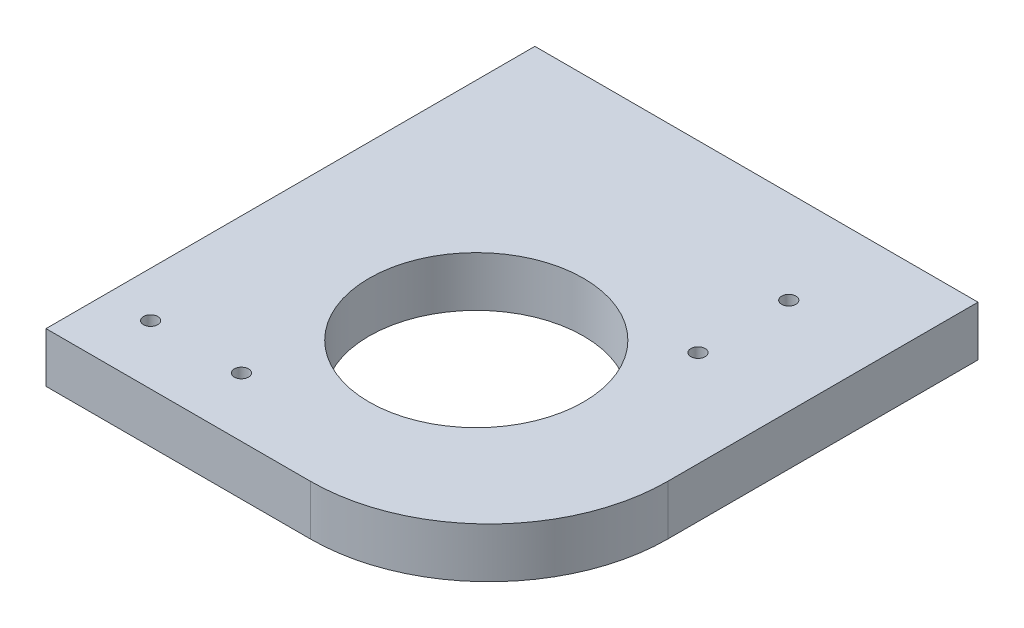
ISO-10303-21;
HEADER;
FILE_DESCRIPTION(('STEP AP214'),'2;1');
FILE_NAME('part.step','',(''),(''),'','','');
FILE_SCHEMA(('AUTOMOTIVE_DESIGN { 1 0 10303 214 1 1 1 1 }'));
ENDSEC;
DATA;
#1=APPLICATION_CONTEXT('core data for automotive mechanical design processes');
#2=APPLICATION_PROTOCOL_DEFINITION('international standard','automotive_design',2000,#1);
#3=PRODUCT_CONTEXT('',#1,'mechanical');
#4=PRODUCT('Part','Part','',(#3));
#5=PRODUCT_RELATED_PRODUCT_CATEGORY('part','',(#4));
#6=PRODUCT_DEFINITION_FORMATION('','',#4);
#7=PRODUCT_DEFINITION_CONTEXT('part definition',#1,'design');
#8=PRODUCT_DEFINITION('design','',#6,#7);
#9=PRODUCT_DEFINITION_SHAPE('','',#8);
#10=(LENGTH_UNIT() NAMED_UNIT(*) SI_UNIT(.MILLI.,.METRE.));
#11=(NAMED_UNIT(*) PLANE_ANGLE_UNIT() SI_UNIT($,.RADIAN.));
#12=(NAMED_UNIT(*) SI_UNIT($,.STERADIAN.) SOLID_ANGLE_UNIT());
#13=UNCERTAINTY_MEASURE_WITH_UNIT(LENGTH_MEASURE(1.E-05),#10,'distance_accuracy_value','');
#14=(GEOMETRIC_REPRESENTATION_CONTEXT(3) GLOBAL_UNCERTAINTY_ASSIGNED_CONTEXT((#13)) GLOBAL_UNIT_ASSIGNED_CONTEXT((#10,
#11,#12)) REPRESENTATION_CONTEXT('',''));
#15=CARTESIAN_POINT('',(0.,0.,0.));
#16=DIRECTION('',(0.,0.,1.));
#17=DIRECTION('',(1.,0.,0.));
#18=AXIS2_PLACEMENT_3D('',#15,#16,#17);
#19=CARTESIAN_POINT('',(0.,0.,0.));
#20=DIRECTION('',(0.,1.,0.));
#21=DIRECTION('',(0.,0.,1.));
#22=AXIS2_PLACEMENT_3D('',#19,#20,#21);
#23=PLANE('',#22);
#24=CARTESIAN_POINT('',(10.9939511690736,0.,5.8999999999998));
#25=DIRECTION('',(0.,-1.,0.));
#26=DIRECTION('',(0.,0.,-1.));
#27=AXIS2_PLACEMENT_3D('',#24,#25,#26);
#28=CIRCLE('',#27,50.);
#29=CARTESIAN_POINT('',(10.9939511690737,0.,55.8999999999998));
#30=VERTEX_POINT('',#29);
#31=CARTESIAN_POINT('',(60.9939511690736,0.,5.89999999999981));
#32=VERTEX_POINT('',#31);
#33=EDGE_CURVE('E68',#30,#32,#28,.F.);
#34=ORIENTED_EDGE('',*,*,#33,.F.);
#35=DIRECTION('',(-1.,0.,0.));
#36=VECTOR('',#35,1.);
#37=CARTESIAN_POINT('',(-63.0000000000001,0.,55.8999999999999));
#38=LINE('',#37,#36);
#39=CARTESIAN_POINT('',(-63.0000000000001,0.,55.8999999999999));
#40=VERTEX_POINT('',#39);
#41=EDGE_CURVE('E60',#30,#40,#38,.T.);
#42=ORIENTED_EDGE('',*,*,#41,.T.);
#43=DIRECTION('',(0.,0.,-1.));
#44=VECTOR('',#43,1.);
#45=CARTESIAN_POINT('',(-63.0000000000001,0.,55.8999999999999));
#46=LINE('',#45,#44);
#47=CARTESIAN_POINT('',(-63.0000000000001,0.,-80.9074000000001));
#48=VERTEX_POINT('',#47);
#49=EDGE_CURVE('E102',#40,#48,#46,.T.);
#50=ORIENTED_EDGE('',*,*,#49,.T.);
#51=DIRECTION('',(-1.,0.,0.));
#52=VECTOR('',#51,1.);
#53=CARTESIAN_POINT('',(0.,0.,-80.9074000000001));
#54=LINE('',#53,#52);
#55=CARTESIAN_POINT('',(60.9939511690736,0.,-80.9074000000001));
#56=VERTEX_POINT('',#55);
#57=EDGE_CURVE('E71',#56,#48,#54,.T.);
#58=ORIENTED_EDGE('',*,*,#57,.F.);
#59=DIRECTION('',(0.,0.,1.));
#60=VECTOR('',#59,1.);
#61=CARTESIAN_POINT('',(60.9939511690736,0.,55.8999999999997));
#62=LINE('',#61,#60);
#63=EDGE_CURVE('E65',#56,#32,#62,.T.);
#64=ORIENTED_EDGE('',*,*,#63,.T.);
#65=EDGE_LOOP('',(#34,#42,#50,#58,#64));
#66=FACE_BOUND('',#65,.T.);
#67=CARTESIAN_POINT('',(0.,0.,-1.50840000000008));
#68=DIRECTION('',(0.,1.,0.));
#69=DIRECTION('',(0.,0.,1.));
#70=AXIS2_PLACEMENT_3D('',#67,#68,#69);
#71=CIRCLE('',#70,30.0000000005334);
#72=CARTESIAN_POINT('',(0.,0.,28.4916000005333));
#73=VERTEX_POINT('',#72);
#74=EDGE_CURVE('E108',#73,#73,#71,.T.);
#75=ORIENTED_EDGE('',*,*,#74,.T.);
#76=EDGE_LOOP('',(#75));
#77=FACE_BOUND('',#76,.T.);
#78=CARTESIAN_POINT('',(-50.3000000000001,0.,39.3191799136919));
#79=DIRECTION('',(0.,1.,0.));
#80=DIRECTION('',(0.,0.,1.));
#81=AXIS2_PLACEMENT_3D('',#78,#79,#80);
#82=CIRCLE('',#81,1.99999999999999);
#83=CARTESIAN_POINT('',(-50.3000000000001,0.,41.3191799136919));
#84=VERTEX_POINT('',#83);
#85=EDGE_CURVE('E139',#84,#84,#82,.T.);
#86=ORIENTED_EDGE('',*,*,#85,.T.);
#87=EDGE_LOOP('',(#86));
#88=FACE_BOUND('',#87,.T.);
#89=CARTESIAN_POINT('',(-24.9000000000001,0.,39.3191799136919));
#90=DIRECTION('',(0.,1.,0.));
#91=DIRECTION('',(0.,0.,1.));
#92=AXIS2_PLACEMENT_3D('',#89,#90,#91);
#93=CIRCLE('',#92,2.);
#94=CARTESIAN_POINT('',(-24.9000000000001,0.,41.3191799136919));
#95=VERTEX_POINT('',#94);
#96=EDGE_CURVE('E142',#95,#95,#93,.T.);
#97=ORIENTED_EDGE('',*,*,#96,.T.);
#98=EDGE_LOOP('',(#97));
#99=FACE_BOUND('',#98,.T.);
#100=CARTESIAN_POINT('',(34.0466301343314,0.,-29.5084000000001));
#101=DIRECTION('',(0.,1.,0.));
#102=DIRECTION('',(0.,0.,1.));
#103=AXIS2_PLACEMENT_3D('',#100,#101,#102);
#104=CIRCLE('',#103,2.);
#105=CARTESIAN_POINT('',(34.0466301343314,0.,-27.5084000000001));
#106=VERTEX_POINT('',#105);
#107=EDGE_CURVE('E144',#106,#106,#104,.T.);
#108=ORIENTED_EDGE('',*,*,#107,.T.);
#109=EDGE_LOOP('',(#108));
#110=FACE_BOUND('',#109,.T.);
#111=CARTESIAN_POINT('',(34.0466301343314,0.,-54.9084000000001));
#112=DIRECTION('',(0.,1.,0.));
#113=DIRECTION('',(0.,0.,1.));
#114=AXIS2_PLACEMENT_3D('',#111,#112,#113);
#115=CIRCLE('',#114,1.99999999999999);
#116=CARTESIAN_POINT('',(34.0466301343314,0.,-52.9084000000001));
#117=VERTEX_POINT('',#116);
#118=EDGE_CURVE('E20',#117,#117,#115,.T.);
#119=ORIENTED_EDGE('',*,*,#118,.T.);
#120=EDGE_LOOP('',(#119));
#121=FACE_BOUND('',#120,.T.);
#122=ADVANCED_FACE('F17',(#66,#77,#88,#99,#110,#121),#23,.F.);
#123=CARTESIAN_POINT('',(34.0466301343314,-11.,-54.9084000000001));
#124=DIRECTION('',(0.,1.,0.));
#125=DIRECTION('',(0.,0.,1.));
#126=AXIS2_PLACEMENT_3D('',#123,#124,#125);
#127=CYLINDRICAL_SURFACE('',#126,1.99999999999999);
#128=CARTESIAN_POINT('',(34.0466301343314,14.,-54.9084000000001));
#129=DIRECTION('',(0.,1.,0.));
#130=DIRECTION('',(0.,0.,1.));
#131=AXIS2_PLACEMENT_3D('',#128,#129,#130);
#132=CIRCLE('',#131,1.99999999999999);
#133=CARTESIAN_POINT('',(34.0466301343314,14.,-52.9084000000001));
#134=VERTEX_POINT('',#133);
#135=EDGE_CURVE('E112',#134,#134,#132,.F.);
#136=ORIENTED_EDGE('',*,*,#135,.F.);
#137=EDGE_LOOP('',(#136));
#138=FACE_BOUND('',#137,.T.);
#139=ORIENTED_EDGE('',*,*,#118,.F.);
#140=EDGE_LOOP('',(#139));
#141=FACE_BOUND('',#140,.T.);
#142=ADVANCED_FACE('F152',(#138,#141),#127,.F.);
#143=CARTESIAN_POINT('',(34.0466301343314,-11.,-29.5084000000001));
#144=DIRECTION('',(0.,1.,0.));
#145=DIRECTION('',(0.,0.,1.));
#146=AXIS2_PLACEMENT_3D('',#143,#144,#145);
#147=CYLINDRICAL_SURFACE('',#146,2.);
#148=CARTESIAN_POINT('',(34.0466301343314,14.,-29.5084000000001));
#149=DIRECTION('',(0.,1.,0.));
#150=DIRECTION('',(0.,0.,1.));
#151=AXIS2_PLACEMENT_3D('',#148,#149,#150);
#152=CIRCLE('',#151,2.);
#153=CARTESIAN_POINT('',(34.0466301343314,14.,-27.5084000000001));
#154=VERTEX_POINT('',#153);
#155=EDGE_CURVE('E132',#154,#154,#152,.F.);
#156=ORIENTED_EDGE('',*,*,#155,.F.);
#157=EDGE_LOOP('',(#156));
#158=FACE_BOUND('',#157,.T.);
#159=ORIENTED_EDGE('',*,*,#107,.F.);
#160=EDGE_LOOP('',(#159));
#161=FACE_BOUND('',#160,.T.);
#162=ADVANCED_FACE('F154',(#158,#161),#147,.F.);
#163=CARTESIAN_POINT('',(-24.9000000000001,-11.,39.3191799136919));
#164=DIRECTION('',(0.,1.,0.));
#165=DIRECTION('',(0.,0.,1.));
#166=AXIS2_PLACEMENT_3D('',#163,#164,#165);
#167=CYLINDRICAL_SURFACE('',#166,2.);
#168=CARTESIAN_POINT('',(-24.9000000000001,14.,39.3191799136919));
#169=DIRECTION('',(0.,1.,0.));
#170=DIRECTION('',(0.,0.,1.));
#171=AXIS2_PLACEMENT_3D('',#168,#169,#170);
#172=CIRCLE('',#171,2.);
#173=CARTESIAN_POINT('',(-24.9000000000001,14.,41.3191799136919));
#174=VERTEX_POINT('',#173);
#175=EDGE_CURVE('E129',#174,#174,#172,.F.);
#176=ORIENTED_EDGE('',*,*,#175,.F.);
#177=EDGE_LOOP('',(#176));
#178=FACE_BOUND('',#177,.T.);
#179=ORIENTED_EDGE('',*,*,#96,.F.);
#180=EDGE_LOOP('',(#179));
#181=FACE_BOUND('',#180,.T.);
#182=ADVANCED_FACE('F161',(#178,#181),#167,.F.);
#183=CARTESIAN_POINT('',(-50.3000000000001,-11.,39.3191799136919));
#184=DIRECTION('',(0.,1.,0.));
#185=DIRECTION('',(0.,0.,1.));
#186=AXIS2_PLACEMENT_3D('',#183,#184,#185);
#187=CYLINDRICAL_SURFACE('',#186,1.99999999999999);
#188=CARTESIAN_POINT('',(-50.3000000000001,14.,39.3191799136919));
#189=DIRECTION('',(0.,1.,0.));
#190=DIRECTION('',(0.,0.,1.));
#191=AXIS2_PLACEMENT_3D('',#188,#189,#190);
#192=CIRCLE('',#191,1.99999999999999);
#193=CARTESIAN_POINT('',(-50.3000000000001,14.,41.3191799136919));
#194=VERTEX_POINT('',#193);
#195=EDGE_CURVE('E126',#194,#194,#192,.F.);
#196=ORIENTED_EDGE('',*,*,#195,.F.);
#197=EDGE_LOOP('',(#196));
#198=FACE_BOUND('',#197,.T.);
#199=ORIENTED_EDGE('',*,*,#85,.F.);
#200=EDGE_LOOP('',(#199));
#201=FACE_BOUND('',#200,.T.);
#202=ADVANCED_FACE('F190',(#198,#201),#187,.F.);
#203=CARTESIAN_POINT('',(0.,-26.,-1.50840000000008));
#204=DIRECTION('',(0.,1.,0.));
#205=DIRECTION('',(0.,0.,1.));
#206=AXIS2_PLACEMENT_3D('',#203,#204,#205);
#207=CYLINDRICAL_SURFACE('',#206,30.0000000005334);
#208=CARTESIAN_POINT('',(0.,14.,-1.50840000000008));
#209=DIRECTION('',(0.,1.,0.));
#210=DIRECTION('',(0.,0.,1.));
#211=AXIS2_PLACEMENT_3D('',#208,#209,#210);
#212=CIRCLE('',#211,30.0000000005334);
#213=CARTESIAN_POINT('',(0.,14.,28.4916000005333));
#214=VERTEX_POINT('',#213);
#215=EDGE_CURVE('E123',#214,#214,#212,.F.);
#216=ORIENTED_EDGE('',*,*,#215,.F.);
#217=EDGE_LOOP('',(#216));
#218=FACE_BOUND('',#217,.T.);
#219=ORIENTED_EDGE('',*,*,#74,.F.);
#220=EDGE_LOOP('',(#219));
#221=FACE_BOUND('',#220,.T.);
#222=ADVANCED_FACE('F187',(#218,#221),#207,.F.);
#223=CARTESIAN_POINT('',(-63.0000000000001,14.,55.8999999999999));
#224=DIRECTION('',(0.,0.,-1.));
#225=DIRECTION('',(-1.,0.,0.));
#226=AXIS2_PLACEMENT_3D('',#223,#224,#225);
#227=PLANE('',#226);
#228=DIRECTION('',(0.,-1.,0.));
#229=VECTOR('',#228,1.);
#230=CARTESIAN_POINT('',(10.9939511690737,14.,55.8999999999998));
#231=LINE('',#230,#229);
#232=CARTESIAN_POINT('',(10.9939511690737,14.,55.8999999999999));
#233=VERTEX_POINT('',#232);
#234=EDGE_CURVE('E81',#233,#30,#231,.T.);
#235=ORIENTED_EDGE('',*,*,#234,.F.);
#236=DIRECTION('',(1.,0.,0.));
#237=VECTOR('',#236,1.);
#238=CARTESIAN_POINT('',(0.,14.,55.8999999999999));
#239=LINE('',#238,#237);
#240=CARTESIAN_POINT('',(-63.0000000000001,14.,55.8999999999999));
#241=VERTEX_POINT('',#240);
#242=EDGE_CURVE('E122',#241,#233,#239,.T.);
#243=ORIENTED_EDGE('',*,*,#242,.F.);
#244=DIRECTION('',(0.,1.,0.));
#245=VECTOR('',#244,1.);
#246=CARTESIAN_POINT('',(-63.0000000000001,14.,55.8999999999999));
#247=LINE('',#246,#245);
#248=EDGE_CURVE('E100',#241,#40,#247,.F.);
#249=ORIENTED_EDGE('',*,*,#248,.T.);
#250=ORIENTED_EDGE('',*,*,#41,.F.);
#251=EDGE_LOOP('',(#235,#243,#249,#250));
#252=FACE_BOUND('',#251,.T.);
#253=ADVANCED_FACE('F184',(#252),#227,.F.);
#254=CARTESIAN_POINT('',(10.9939511690736,14.,5.8999999999998));
#255=DIRECTION('',(0.,-1.,0.));
#256=DIRECTION('',(0.,0.,-1.));
#257=AXIS2_PLACEMENT_3D('',#254,#255,#256);
#258=CYLINDRICAL_SURFACE('',#257,50.);
#259=ORIENTED_EDGE('',*,*,#33,.T.);
#260=DIRECTION('',(0.,1.,0.));
#261=VECTOR('',#260,1.);
#262=CARTESIAN_POINT('',(60.9939511690736,14.,5.89999999999981));
#263=LINE('',#262,#261);
#264=CARTESIAN_POINT('',(60.9939511690736,14.,5.89999999999981));
#265=VERTEX_POINT('',#264);
#266=EDGE_CURVE('E75',#32,#265,#263,.T.);
#267=ORIENTED_EDGE('',*,*,#266,.T.);
#268=CARTESIAN_POINT('',(10.9939511690736,14.,5.8999999999998));
#269=DIRECTION('',(0.,-1.,0.));
#270=DIRECTION('',(0.,0.,-1.));
#271=AXIS2_PLACEMENT_3D('',#268,#269,#270);
#272=CIRCLE('',#271,50.);
#273=EDGE_CURVE('E120',#233,#265,#272,.F.);
#274=ORIENTED_EDGE('',*,*,#273,.F.);
#275=ORIENTED_EDGE('',*,*,#234,.T.);
#276=EDGE_LOOP('',(#259,#267,#274,#275));
#277=FACE_BOUND('',#276,.T.);
#278=ADVANCED_FACE('F78',(#277),#258,.T.);
#279=CARTESIAN_POINT('',(60.9939511690736,14.,55.8999999999997));
#280=DIRECTION('',(-1.,0.,0.));
#281=DIRECTION('',(0.,0.,1.));
#282=AXIS2_PLACEMENT_3D('',#279,#280,#281);
#283=PLANE('',#282);
#284=ORIENTED_EDGE('',*,*,#266,.F.);
#285=ORIENTED_EDGE('',*,*,#63,.F.);
#286=DIRECTION('',(0.,1.,0.));
#287=VECTOR('',#286,1.);
#288=CARTESIAN_POINT('',(60.9939511690736,0.,-80.9074000000001));
#289=LINE('',#288,#287);
#290=CARTESIAN_POINT('',(60.9939511690736,14.,-80.9074000000001));
#291=VERTEX_POINT('',#290);
#292=EDGE_CURVE('E87',#291,#56,#289,.F.);
#293=ORIENTED_EDGE('',*,*,#292,.F.);
#294=DIRECTION('',(0.,0.,1.));
#295=VECTOR('',#294,1.);
#296=CARTESIAN_POINT('',(60.9939511690736,14.,0.));
#297=LINE('',#296,#295);
#298=EDGE_CURVE('E85',#265,#291,#297,.F.);
#299=ORIENTED_EDGE('',*,*,#298,.F.);
#300=EDGE_LOOP('',(#284,#285,#293,#299));
#301=FACE_BOUND('',#300,.T.);
#302=ADVANCED_FACE('F83',(#301),#283,.F.);
#303=CARTESIAN_POINT('',(0.,0.,-80.9074000000001));
#304=DIRECTION('',(0.,0.,-1.));
#305=DIRECTION('',(-1.,0.,0.));
#306=AXIS2_PLACEMENT_3D('',#303,#304,#305);
#307=PLANE('',#306);
#308=DIRECTION('',(0.,1.,0.));
#309=VECTOR('',#308,1.);
#310=CARTESIAN_POINT('',(-63.0000000000001,14.,-80.9074000000001));
#311=LINE('',#310,#309);
#312=CARTESIAN_POINT('',(-63.0000000000001,14.,-80.9074000000001));
#313=VERTEX_POINT('',#312);
#314=EDGE_CURVE('E35',#48,#313,#311,.T.);
#315=ORIENTED_EDGE('',*,*,#314,.T.);
#316=DIRECTION('',(1.,0.,0.));
#317=VECTOR('',#316,1.);
#318=CARTESIAN_POINT('',(0.,14.,-80.9074000000001));
#319=LINE('',#318,#317);
#320=EDGE_CURVE('E26',#291,#313,#319,.F.);
#321=ORIENTED_EDGE('',*,*,#320,.F.);
#322=ORIENTED_EDGE('',*,*,#292,.T.);
#323=ORIENTED_EDGE('',*,*,#57,.T.);
#324=EDGE_LOOP('',(#315,#321,#322,#323));
#325=FACE_BOUND('',#324,.T.);
#326=ADVANCED_FACE('F173',(#325),#307,.T.);
#327=CARTESIAN_POINT('',(-63.0000000000001,14.,55.8999999999999));
#328=DIRECTION('',(1.,0.,0.));
#329=DIRECTION('',(0.,0.,-1.));
#330=AXIS2_PLACEMENT_3D('',#327,#328,#329);
#331=PLANE('',#330);
#332=ORIENTED_EDGE('',*,*,#248,.F.);
#333=DIRECTION('',(0.,0.,1.));
#334=VECTOR('',#333,1.);
#335=CARTESIAN_POINT('',(-63.0000000000001,14.,0.));
#336=LINE('',#335,#334);
#337=EDGE_CURVE('E11',#313,#241,#336,.T.);
#338=ORIENTED_EDGE('',*,*,#337,.F.);
#339=ORIENTED_EDGE('',*,*,#314,.F.);
#340=ORIENTED_EDGE('',*,*,#49,.F.);
#341=EDGE_LOOP('',(#332,#338,#339,#340));
#342=FACE_BOUND('',#341,.T.);
#343=ADVANCED_FACE('F167',(#342),#331,.F.);
#344=CARTESIAN_POINT('',(0.,14.,0.));
#345=DIRECTION('',(0.,1.,0.));
#346=DIRECTION('',(0.,0.,1.));
#347=AXIS2_PLACEMENT_3D('',#344,#345,#346);
#348=PLANE('',#347);
#349=ORIENTED_EDGE('',*,*,#320,.T.);
#350=ORIENTED_EDGE('',*,*,#337,.T.);
#351=ORIENTED_EDGE('',*,*,#242,.T.);
#352=ORIENTED_EDGE('',*,*,#273,.T.);
#353=ORIENTED_EDGE('',*,*,#298,.T.);
#354=EDGE_LOOP('',(#349,#350,#351,#352,#353));
#355=FACE_BOUND('',#354,.T.);
#356=ORIENTED_EDGE('',*,*,#215,.T.);
#357=EDGE_LOOP('',(#356));
#358=FACE_BOUND('',#357,.T.);
#359=ORIENTED_EDGE('',*,*,#195,.T.);
#360=EDGE_LOOP('',(#359));
#361=FACE_BOUND('',#360,.T.);
#362=ORIENTED_EDGE('',*,*,#175,.T.);
#363=EDGE_LOOP('',(#362));
#364=FACE_BOUND('',#363,.T.);
#365=ORIENTED_EDGE('',*,*,#155,.T.);
#366=EDGE_LOOP('',(#365));
#367=FACE_BOUND('',#366,.T.);
#368=ORIENTED_EDGE('',*,*,#135,.T.);
#369=EDGE_LOOP('',(#368));
#370=FACE_BOUND('',#369,.T.);
#371=ADVANCED_FACE('F165',(#355,#358,#361,#364,#367,#370),#348,.T.);
#372=CLOSED_SHELL('',(#122,#142,#162,#182,#202,#222,#253,#278,#302,#326,#343,#371));
#373=MANIFOLD_SOLID_BREP('B1',#372);
#374=ADVANCED_BREP_SHAPE_REPRESENTATION('',(#18,#373),#14);
#375=SHAPE_DEFINITION_REPRESENTATION(#9,#374);
ENDSEC;
END-ISO-10303-21;
